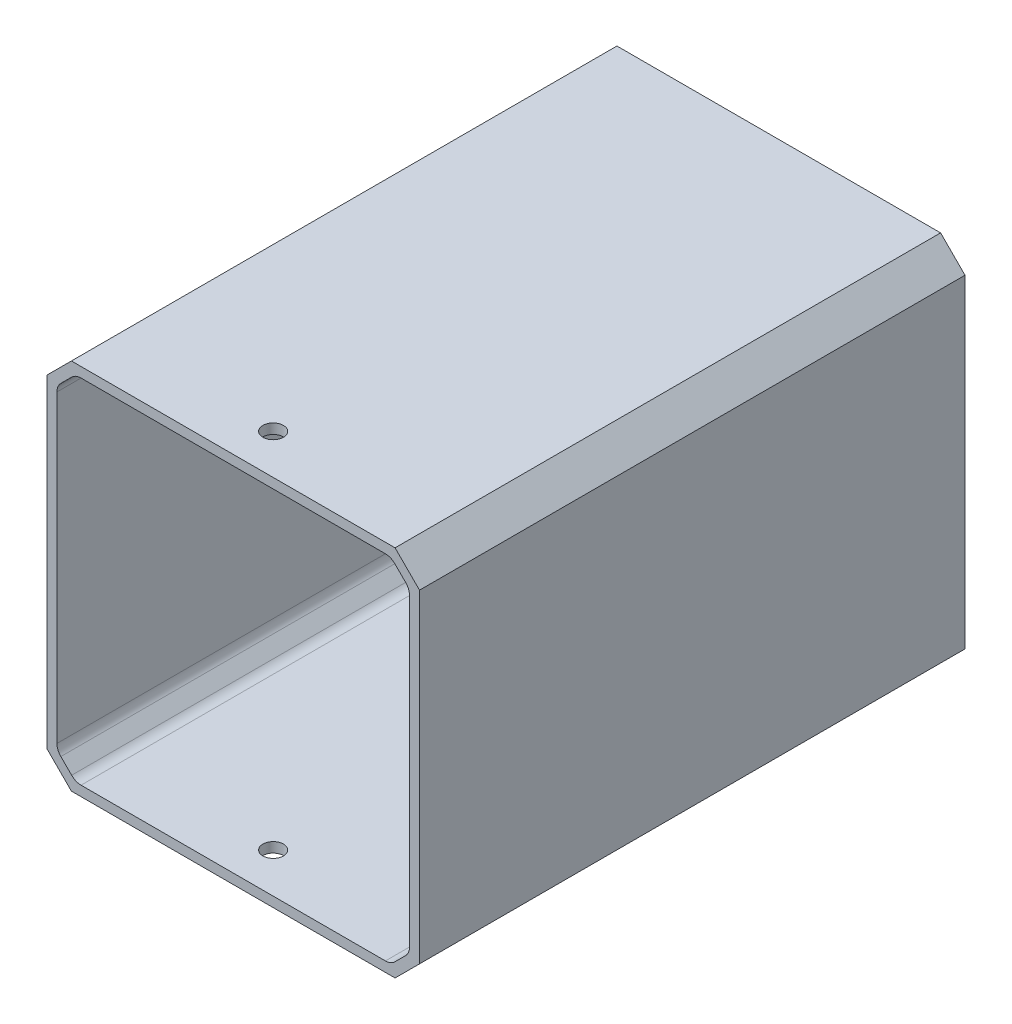
ISO-10303-21;
HEADER;
FILE_DESCRIPTION(('STEP AP214'),'2;1');
FILE_NAME('part.step','',(''),(''),'','','');
FILE_SCHEMA(('AUTOMOTIVE_DESIGN { 1 0 10303 214 1 1 1 1 }'));
ENDSEC;
DATA;
#1=APPLICATION_CONTEXT('core data for automotive mechanical design processes');
#2=APPLICATION_PROTOCOL_DEFINITION('international standard','automotive_design',2000,#1);
#3=PRODUCT_CONTEXT('',#1,'mechanical');
#4=PRODUCT('Part','Part','',(#3));
#5=PRODUCT_RELATED_PRODUCT_CATEGORY('part','',(#4));
#6=PRODUCT_DEFINITION_FORMATION('','',#4);
#7=PRODUCT_DEFINITION_CONTEXT('part definition',#1,'design');
#8=PRODUCT_DEFINITION('design','',#6,#7);
#9=PRODUCT_DEFINITION_SHAPE('','',#8);
#10=(LENGTH_UNIT() NAMED_UNIT(*) SI_UNIT(.MILLI.,.METRE.));
#11=(NAMED_UNIT(*) PLANE_ANGLE_UNIT() SI_UNIT($,.RADIAN.));
#12=(NAMED_UNIT(*) SI_UNIT($,.STERADIAN.) SOLID_ANGLE_UNIT());
#13=UNCERTAINTY_MEASURE_WITH_UNIT(LENGTH_MEASURE(1.E-05),#10,'distance_accuracy_value','');
#14=(GEOMETRIC_REPRESENTATION_CONTEXT(3) GLOBAL_UNCERTAINTY_ASSIGNED_CONTEXT((#13)) GLOBAL_UNIT_ASSIGNED_CONTEXT((#10,
#11,#12)) REPRESENTATION_CONTEXT('',''));
#15=CARTESIAN_POINT('',(0.,0.,0.));
#16=DIRECTION('',(0.,0.,1.));
#17=DIRECTION('',(1.,0.,0.));
#18=AXIS2_PLACEMENT_3D('',#15,#16,#17);
#19=CARTESIAN_POINT('',(28.,24.3259018078045,2.));
#20=DIRECTION('',(-1.,0.,0.));
#21=DIRECTION('',(0.,-1.,0.));
#22=AXIS2_PLACEMENT_3D('',#19,#20,#21);
#23=PLANE('',#22);
#24=DIRECTION('',(0.,1.,0.));
#25=VECTOR('',#24,1.);
#26=CARTESIAN_POINT('',(28.,24.3259018078045,0.));
#27=LINE('',#26,#25);
#28=CARTESIAN_POINT('',(28.,-24.3259018078045,0.));
#29=VERTEX_POINT('',#28);
#30=CARTESIAN_POINT('',(28.,24.3259018078045,0.));
#31=VERTEX_POINT('',#30);
#32=EDGE_CURVE('E353',#29,#31,#27,.T.);
#33=ORIENTED_EDGE('',*,*,#32,.T.);
#34=DIRECTION('',(0.,0.,-1.));
#35=VECTOR('',#34,1.);
#36=CARTESIAN_POINT('',(28.,24.3259018078045,2.));
#37=LINE('',#36,#35);
#38=CARTESIAN_POINT('',(28.,24.3259018078045,82.));
#39=VERTEX_POINT('',#38);
#40=EDGE_CURVE('E355',#39,#31,#37,.T.);
#41=ORIENTED_EDGE('',*,*,#40,.F.);
#42=DIRECTION('',(0.,1.,0.));
#43=VECTOR('',#42,1.);
#44=CARTESIAN_POINT('',(28.,-24.3259018078045,82.));
#45=LINE('',#44,#43);
#46=CARTESIAN_POINT('',(28.,-24.3259018078045,82.));
#47=VERTEX_POINT('',#46);
#48=EDGE_CURVE('E319',#47,#39,#45,.T.);
#49=ORIENTED_EDGE('',*,*,#48,.F.);
#50=DIRECTION('',(0.,0.,-1.));
#51=VECTOR('',#50,1.);
#52=CARTESIAN_POINT('',(28.,-24.3259018078045,2.));
#53=LINE('',#52,#51);
#54=EDGE_CURVE('E358',#47,#29,#53,.T.);
#55=ORIENTED_EDGE('',*,*,#54,.T.);
#56=EDGE_LOOP('',(#33,#41,#49,#55));
#57=FACE_BOUND('',#56,.T.);
#58=ADVANCED_FACE('F33',(#57),#23,.F.);
#59=CARTESIAN_POINT('',(0.,0.,2.));
#60=DIRECTION('',(0.,0.,1.));
#61=DIRECTION('',(1.,0.,0.));
#62=AXIS2_PLACEMENT_3D('',#59,#60,#61);
#63=PLANE('',#62);
#64=CARTESIAN_POINT('',(0.,0.,2.));
#65=DIRECTION('',(0.,0.,1.));
#66=DIRECTION('',(1.,0.,0.));
#67=AXIS2_PLACEMENT_3D('',#64,#65,#66);
#68=CIRCLE('',#67,11.15);
#69=CARTESIAN_POINT('',(-11.1004504413109,-1.05,2.));
#70=VERTEX_POINT('',#69);
#71=CARTESIAN_POINT('',(-11.1004504413109,1.05,2.));
#72=VERTEX_POINT('',#71);
#73=EDGE_CURVE('E226',#70,#72,#68,.T.);
#74=ORIENTED_EDGE('',*,*,#73,.F.);
#75=DIRECTION('',(1.,0.,0.));
#76=VECTOR('',#75,1.);
#77=CARTESIAN_POINT('',(-10.8280884739644,-1.05,2.));
#78=LINE('',#77,#76);
#79=CARTESIAN_POINT('',(-9.6,-1.05,2.));
#80=VERTEX_POINT('',#79);
#81=EDGE_CURVE('E218',#70,#80,#78,.T.);
#82=ORIENTED_EDGE('',*,*,#81,.T.);
#83=DIRECTION('',(0.,1.,0.));
#84=VECTOR('',#83,1.);
#85=CARTESIAN_POINT('',(-9.6,-1.05,2.));
#86=LINE('',#85,#84);
#87=CARTESIAN_POINT('',(-9.6,1.05,2.));
#88=VERTEX_POINT('',#87);
#89=EDGE_CURVE('E224',#80,#88,#86,.T.);
#90=ORIENTED_EDGE('',*,*,#89,.T.);
#91=DIRECTION('',(-1.,0.,0.));
#92=VECTOR('',#91,1.);
#93=CARTESIAN_POINT('',(-10.8280884739644,1.05,2.));
#94=LINE('',#93,#92);
#95=EDGE_CURVE('E231',#88,#72,#94,.T.);
#96=ORIENTED_EDGE('',*,*,#95,.T.);
#97=EDGE_LOOP('',(#74,#82,#90,#96));
#98=FACE_BOUND('',#97,.T.);
#99=DIRECTION('',(1.,0.,0.));
#100=VECTOR('',#99,1.);
#101=CARTESIAN_POINT('',(-23.7045814642449,-26.5,2.));
#102=LINE('',#101,#100);
#103=CARTESIAN_POINT('',(-22.8761543394987,-26.5,2.));
#104=VERTEX_POINT('',#103);
#105=CARTESIAN_POINT('',(22.8761543394987,-26.5,2.));
#106=VERTEX_POINT('',#105);
#107=EDGE_CURVE('E291',#104,#106,#102,.T.);
#108=ORIENTED_EDGE('',*,*,#107,.T.);
#109=CARTESIAN_POINT('',(22.8761543394987,-24.5,2.));
#110=DIRECTION('',(0.,0.,1.));
#111=DIRECTION('',(1.,0.,0.));
#112=AXIS2_PLACEMENT_3D('',#109,#110,#111);
#113=CIRCLE('',#112,2.);
#114=CARTESIAN_POINT('',(24.2903679018718,-25.9142135623731,2.));
#115=VERTEX_POINT('',#114);
#116=EDGE_CURVE('E404',#106,#115,#113,.T.);
#117=ORIENTED_EDGE('',*,*,#116,.T.);
#118=DIRECTION('',(0.707106781186548,0.707106781186548,0.));
#119=VECTOR('',#118,1.);
#120=CARTESIAN_POINT('',(23.7045814642449,-26.5,2.));
#121=LINE('',#120,#119);
#122=CARTESIAN_POINT('',(25.9142135623731,-24.2903679018718,2.));
#123=VERTEX_POINT('',#122);
#124=EDGE_CURVE('E294',#115,#123,#121,.T.);
#125=ORIENTED_EDGE('',*,*,#124,.T.);
#126=CARTESIAN_POINT('',(24.5,-22.8761543394987,2.));
#127=DIRECTION('',(0.,0.,1.));
#128=DIRECTION('',(1.,0.,0.));
#129=AXIS2_PLACEMENT_3D('',#126,#127,#128);
#130=CIRCLE('',#129,2.);
#131=CARTESIAN_POINT('',(26.5,-22.8761543394987,2.));
#132=VERTEX_POINT('',#131);
#133=EDGE_CURVE('E402',#123,#132,#130,.T.);
#134=ORIENTED_EDGE('',*,*,#133,.T.);
#135=DIRECTION('',(0.,1.,0.));
#136=VECTOR('',#135,1.);
#137=CARTESIAN_POINT('',(26.5,-23.7045814642449,2.));
#138=LINE('',#137,#136);
#139=CARTESIAN_POINT('',(26.5,22.8761543394987,2.));
#140=VERTEX_POINT('',#139);
#141=EDGE_CURVE('E297',#132,#140,#138,.T.);
#142=ORIENTED_EDGE('',*,*,#141,.T.);
#143=CARTESIAN_POINT('',(24.5,22.8761543394987,2.));
#144=DIRECTION('',(0.,0.,1.));
#145=DIRECTION('',(1.,0.,0.));
#146=AXIS2_PLACEMENT_3D('',#143,#144,#145);
#147=CIRCLE('',#146,2.);
#148=CARTESIAN_POINT('',(25.9142135623731,24.2903679018718,2.));
#149=VERTEX_POINT('',#148);
#150=EDGE_CURVE('E396',#140,#149,#147,.T.);
#151=ORIENTED_EDGE('',*,*,#150,.T.);
#152=DIRECTION('',(-0.707106781186547,0.707106781186548,0.));
#153=VECTOR('',#152,1.);
#154=CARTESIAN_POINT('',(26.5,23.7045814642449,2.));
#155=LINE('',#154,#153);
#156=CARTESIAN_POINT('',(24.2903679018718,25.9142135623731,2.));
#157=VERTEX_POINT('',#156);
#158=EDGE_CURVE('E300',#149,#157,#155,.T.);
#159=ORIENTED_EDGE('',*,*,#158,.T.);
#160=CARTESIAN_POINT('',(22.8761543394987,24.5,2.));
#161=DIRECTION('',(0.,0.,1.));
#162=DIRECTION('',(1.,0.,0.));
#163=AXIS2_PLACEMENT_3D('',#160,#161,#162);
#164=CIRCLE('',#163,2.);
#165=CARTESIAN_POINT('',(22.8761543394987,26.5,2.));
#166=VERTEX_POINT('',#165);
#167=EDGE_CURVE('E394',#157,#166,#164,.T.);
#168=ORIENTED_EDGE('',*,*,#167,.T.);
#169=DIRECTION('',(-1.,0.,0.));
#170=VECTOR('',#169,1.);
#171=CARTESIAN_POINT('',(23.7045814642449,26.5,2.));
#172=LINE('',#171,#170);
#173=CARTESIAN_POINT('',(-22.8761543394987,26.5,2.));
#174=VERTEX_POINT('',#173);
#175=EDGE_CURVE('E303',#166,#174,#172,.T.);
#176=ORIENTED_EDGE('',*,*,#175,.T.);
#177=CARTESIAN_POINT('',(-22.8761543394987,24.5,2.));
#178=DIRECTION('',(0.,0.,1.));
#179=DIRECTION('',(1.,0.,0.));
#180=AXIS2_PLACEMENT_3D('',#177,#178,#179);
#181=CIRCLE('',#180,2.);
#182=CARTESIAN_POINT('',(-24.2903679018718,25.9142135623731,2.));
#183=VERTEX_POINT('',#182);
#184=EDGE_CURVE('E392',#174,#183,#181,.T.);
#185=ORIENTED_EDGE('',*,*,#184,.T.);
#186=DIRECTION('',(-0.707106781186548,-0.707106781186547,0.));
#187=VECTOR('',#186,1.);
#188=CARTESIAN_POINT('',(-23.7045814642449,26.5,2.));
#189=LINE('',#188,#187);
#190=CARTESIAN_POINT('',(-25.9142135623731,24.2903679018718,2.));
#191=VERTEX_POINT('',#190);
#192=EDGE_CURVE('E306',#183,#191,#189,.T.);
#193=ORIENTED_EDGE('',*,*,#192,.T.);
#194=CARTESIAN_POINT('',(-24.5,22.8761543394987,2.));
#195=DIRECTION('',(0.,0.,1.));
#196=DIRECTION('',(1.,0.,0.));
#197=AXIS2_PLACEMENT_3D('',#194,#195,#196);
#198=CIRCLE('',#197,2.);
#199=CARTESIAN_POINT('',(-26.5,22.8761543394987,2.));
#200=VERTEX_POINT('',#199);
#201=EDGE_CURVE('E390',#191,#200,#198,.T.);
#202=ORIENTED_EDGE('',*,*,#201,.T.);
#203=DIRECTION('',(0.,-1.,0.));
#204=VECTOR('',#203,1.);
#205=CARTESIAN_POINT('',(-26.5,23.7045814642449,2.));
#206=LINE('',#205,#204);
#207=CARTESIAN_POINT('',(-26.5,-22.8761543394987,2.));
#208=VERTEX_POINT('',#207);
#209=EDGE_CURVE('E268',#200,#208,#206,.T.);
#210=ORIENTED_EDGE('',*,*,#209,.T.);
#211=CARTESIAN_POINT('',(-24.5,-22.8761543394987,2.));
#212=DIRECTION('',(0.,0.,1.));
#213=DIRECTION('',(1.,0.,0.));
#214=AXIS2_PLACEMENT_3D('',#211,#212,#213);
#215=CIRCLE('',#214,2.);
#216=CARTESIAN_POINT('',(-25.9142135623731,-24.2903679018718,2.));
#217=VERTEX_POINT('',#216);
#218=EDGE_CURVE('E398',#208,#217,#215,.T.);
#219=ORIENTED_EDGE('',*,*,#218,.T.);
#220=DIRECTION('',(0.707106781186548,-0.707106781186547,0.));
#221=VECTOR('',#220,1.);
#222=CARTESIAN_POINT('',(-26.5,-23.7045814642449,2.));
#223=LINE('',#222,#221);
#224=CARTESIAN_POINT('',(-24.2903679018718,-25.9142135623731,2.));
#225=VERTEX_POINT('',#224);
#226=EDGE_CURVE('E263',#217,#225,#223,.T.);
#227=ORIENTED_EDGE('',*,*,#226,.T.);
#228=CARTESIAN_POINT('',(-22.8761543394987,-24.5,2.));
#229=DIRECTION('',(0.,0.,1.));
#230=DIRECTION('',(1.,0.,0.));
#231=AXIS2_PLACEMENT_3D('',#228,#229,#230);
#232=CIRCLE('',#231,2.);
#233=EDGE_CURVE('E400',#225,#104,#232,.T.);
#234=ORIENTED_EDGE('',*,*,#233,.T.);
#235=EDGE_LOOP('',(#108,#117,#125,#134,#142,#151,#159,#168,#176,#185,#193,#202,#210,#219,#227,#234));
#236=FACE_BOUND('',#235,.T.);
#237=ADVANCED_FACE('F220',(#98,#236),#63,.T.);
#238=CARTESIAN_POINT('',(0.,0.,0.));
#239=DIRECTION('',(0.,0.,1.));
#240=DIRECTION('',(1.,0.,0.));
#241=AXIS2_PLACEMENT_3D('',#238,#239,#240);
#242=PLANE('',#241);
#243=DIRECTION('',(-1.,0.,0.));
#244=VECTOR('',#243,1.);
#245=CARTESIAN_POINT('',(-10.8280884739644,-1.05,0.));
#246=LINE('',#245,#244);
#247=CARTESIAN_POINT('',(-9.6,-1.05,0.));
#248=VERTEX_POINT('',#247);
#249=CARTESIAN_POINT('',(-11.1004504413109,-1.05,0.));
#250=VERTEX_POINT('',#249);
#251=EDGE_CURVE('E236',#248,#250,#246,.T.);
#252=ORIENTED_EDGE('',*,*,#251,.T.);
#253=CARTESIAN_POINT('',(0.,0.,0.));
#254=DIRECTION('',(0.,0.,1.));
#255=DIRECTION('',(1.,0.,0.));
#256=AXIS2_PLACEMENT_3D('',#253,#254,#255);
#257=CIRCLE('',#256,11.15);
#258=CARTESIAN_POINT('',(-11.1004504413109,1.05,0.));
#259=VERTEX_POINT('',#258);
#260=EDGE_CURVE('E334',#250,#259,#257,.T.);
#261=ORIENTED_EDGE('',*,*,#260,.T.);
#262=DIRECTION('',(1.,0.,0.));
#263=VECTOR('',#262,1.);
#264=CARTESIAN_POINT('',(-10.8280884739644,1.05,0.));
#265=LINE('',#264,#263);
#266=CARTESIAN_POINT('',(-9.6,1.05,0.));
#267=VERTEX_POINT('',#266);
#268=EDGE_CURVE('E249',#259,#267,#265,.T.);
#269=ORIENTED_EDGE('',*,*,#268,.T.);
#270=DIRECTION('',(0.,-1.,0.));
#271=VECTOR('',#270,1.);
#272=CARTESIAN_POINT('',(-9.6,-1.05,0.));
#273=LINE('',#272,#271);
#274=EDGE_CURVE('E251',#267,#248,#273,.T.);
#275=ORIENTED_EDGE('',*,*,#274,.T.);
#276=EDGE_LOOP('',(#252,#261,#269,#275));
#277=FACE_BOUND('',#276,.T.);
#278=DIRECTION('',(-0.707106781186547,0.707106781186548,0.));
#279=VECTOR('',#278,1.);
#280=CARTESIAN_POINT('',(28.,24.3259018078045,0.));
#281=LINE('',#280,#279);
#282=CARTESIAN_POINT('',(24.3259018078045,28.,0.));
#283=VERTEX_POINT('',#282);
#284=EDGE_CURVE('E336',#31,#283,#281,.T.);
#285=ORIENTED_EDGE('',*,*,#284,.F.);
#286=ORIENTED_EDGE('',*,*,#32,.F.);
#287=DIRECTION('',(0.707106781186548,0.707106781186548,0.));
#288=VECTOR('',#287,1.);
#289=CARTESIAN_POINT('',(24.3259018078045,-28.,0.));
#290=LINE('',#289,#288);
#291=CARTESIAN_POINT('',(24.3259018078045,-28.,0.));
#292=VERTEX_POINT('',#291);
#293=EDGE_CURVE('E351',#292,#29,#290,.T.);
#294=ORIENTED_EDGE('',*,*,#293,.F.);
#295=DIRECTION('',(1.,0.,0.));
#296=VECTOR('',#295,1.);
#297=CARTESIAN_POINT('',(-24.3259018078045,-28.,0.));
#298=LINE('',#297,#296);
#299=CARTESIAN_POINT('',(-24.3259018078045,-28.,0.));
#300=VERTEX_POINT('',#299);
#301=EDGE_CURVE('E349',#300,#292,#298,.T.);
#302=ORIENTED_EDGE('',*,*,#301,.F.);
#303=DIRECTION('',(0.707106781186548,-0.707106781186547,0.));
#304=VECTOR('',#303,1.);
#305=CARTESIAN_POINT('',(-28.,-24.3259018078045,0.));
#306=LINE('',#305,#304);
#307=CARTESIAN_POINT('',(-28.,-24.3259018078045,0.));
#308=VERTEX_POINT('',#307);
#309=EDGE_CURVE('E347',#308,#300,#306,.T.);
#310=ORIENTED_EDGE('',*,*,#309,.F.);
#311=DIRECTION('',(0.,-1.,0.));
#312=VECTOR('',#311,1.);
#313=CARTESIAN_POINT('',(-28.,24.3259018078045,0.));
#314=LINE('',#313,#312);
#315=CARTESIAN_POINT('',(-28.,24.3259018078045,0.));
#316=VERTEX_POINT('',#315);
#317=EDGE_CURVE('E345',#316,#308,#314,.T.);
#318=ORIENTED_EDGE('',*,*,#317,.F.);
#319=DIRECTION('',(-0.707106781186548,-0.707106781186547,0.));
#320=VECTOR('',#319,1.);
#321=CARTESIAN_POINT('',(-24.3259018078045,28.,0.));
#322=LINE('',#321,#320);
#323=CARTESIAN_POINT('',(-24.3259018078045,28.,0.));
#324=VERTEX_POINT('',#323);
#325=EDGE_CURVE('E343',#324,#316,#322,.T.);
#326=ORIENTED_EDGE('',*,*,#325,.F.);
#327=DIRECTION('',(-1.,0.,0.));
#328=VECTOR('',#327,1.);
#329=CARTESIAN_POINT('',(-24.3259018078045,28.,0.));
#330=LINE('',#329,#328);
#331=EDGE_CURVE('E341',#283,#324,#330,.T.);
#332=ORIENTED_EDGE('',*,*,#331,.F.);
#333=EDGE_LOOP('',(#285,#286,#294,#302,#310,#318,#326,#332));
#334=FACE_BOUND('',#333,.T.);
#335=ADVANCED_FACE('F530',(#277,#334),#242,.F.);
#336=CARTESIAN_POINT('',(28.,24.3259018078045,2.));
#337=DIRECTION('',(-0.707106781186548,-0.707106781186547,0.));
#338=DIRECTION('',(0.707106781186547,-0.707106781186548,0.));
#339=AXIS2_PLACEMENT_3D('',#336,#337,#338);
#340=PLANE('',#339);
#341=ORIENTED_EDGE('',*,*,#284,.T.);
#342=DIRECTION('',(0.,0.,-1.));
#343=VECTOR('',#342,1.);
#344=CARTESIAN_POINT('',(24.3259018078045,28.,2.));
#345=LINE('',#344,#343);
#346=CARTESIAN_POINT('',(24.3259018078045,28.,82.));
#347=VERTEX_POINT('',#346);
#348=EDGE_CURVE('E376',#347,#283,#345,.T.);
#349=ORIENTED_EDGE('',*,*,#348,.F.);
#350=DIRECTION('',(-0.707106781186547,0.707106781186548,0.));
#351=VECTOR('',#350,1.);
#352=CARTESIAN_POINT('',(28.,24.3259018078045,82.));
#353=LINE('',#352,#351);
#354=EDGE_CURVE('E322',#39,#347,#353,.T.);
#355=ORIENTED_EDGE('',*,*,#354,.F.);
#356=ORIENTED_EDGE('',*,*,#40,.T.);
#357=EDGE_LOOP('',(#341,#349,#355,#356));
#358=FACE_BOUND('',#357,.T.);
#359=ADVANCED_FACE('F558',(#358),#340,.F.);
#360=CARTESIAN_POINT('',(-24.3259018078045,28.,2.));
#361=DIRECTION('',(0.,-1.,0.));
#362=DIRECTION('',(1.,0.,0.));
#363=AXIS2_PLACEMENT_3D('',#360,#361,#362);
#364=PLANE('',#363);
#365=CARTESIAN_POINT('',(0.,28.,76.));
#366=DIRECTION('',(0.,-1.,0.));
#367=DIRECTION('',(1.,0.,0.));
#368=AXIS2_PLACEMENT_3D('',#365,#366,#367);
#369=CIRCLE('',#368,1.54999999999999);
#370=CARTESIAN_POINT('',(1.54999999999999,28.,76.));
#371=VERTEX_POINT('',#370);
#372=EDGE_CURVE('E260',#371,#371,#369,.T.);
#373=ORIENTED_EDGE('',*,*,#372,.T.);
#374=EDGE_LOOP('',(#373));
#375=FACE_BOUND('',#374,.T.);
#376=ORIENTED_EDGE('',*,*,#331,.T.);
#377=DIRECTION('',(0.,0.,-1.));
#378=VECTOR('',#377,1.);
#379=CARTESIAN_POINT('',(-24.3259018078045,28.,2.));
#380=LINE('',#379,#378);
#381=CARTESIAN_POINT('',(-24.3259018078045,28.,82.));
#382=VERTEX_POINT('',#381);
#383=EDGE_CURVE('E373',#382,#324,#380,.T.);
#384=ORIENTED_EDGE('',*,*,#383,.F.);
#385=DIRECTION('',(-1.,0.,0.));
#386=VECTOR('',#385,1.);
#387=CARTESIAN_POINT('',(24.3259018078045,28.,82.));
#388=LINE('',#387,#386);
#389=EDGE_CURVE('E325',#347,#382,#388,.T.);
#390=ORIENTED_EDGE('',*,*,#389,.F.);
#391=ORIENTED_EDGE('',*,*,#348,.T.);
#392=EDGE_LOOP('',(#376,#384,#390,#391));
#393=FACE_BOUND('',#392,.T.);
#394=ADVANCED_FACE('F554',(#375,#393),#364,.F.);
#395=CARTESIAN_POINT('',(-24.3259018078045,28.,2.));
#396=DIRECTION('',(0.707106781186547,-0.707106781186548,0.));
#397=DIRECTION('',(0.707106781186548,0.707106781186547,0.));
#398=AXIS2_PLACEMENT_3D('',#395,#396,#397);
#399=PLANE('',#398);
#400=ORIENTED_EDGE('',*,*,#325,.T.);
#401=DIRECTION('',(0.,0.,-1.));
#402=VECTOR('',#401,1.);
#403=CARTESIAN_POINT('',(-28.,24.3259018078045,2.));
#404=LINE('',#403,#402);
#405=CARTESIAN_POINT('',(-28.,24.3259018078045,82.));
#406=VERTEX_POINT('',#405);
#407=EDGE_CURVE('E370',#406,#316,#404,.T.);
#408=ORIENTED_EDGE('',*,*,#407,.F.);
#409=DIRECTION('',(-0.707106781186548,-0.707106781186547,0.));
#410=VECTOR('',#409,1.);
#411=CARTESIAN_POINT('',(-24.3259018078045,28.,82.));
#412=LINE('',#411,#410);
#413=EDGE_CURVE('E328',#382,#406,#412,.T.);
#414=ORIENTED_EDGE('',*,*,#413,.F.);
#415=ORIENTED_EDGE('',*,*,#383,.T.);
#416=EDGE_LOOP('',(#400,#408,#414,#415));
#417=FACE_BOUND('',#416,.T.);
#418=ADVANCED_FACE('F550',(#417),#399,.F.);
#419=CARTESIAN_POINT('',(-28.,24.3259018078045,2.));
#420=DIRECTION('',(1.,0.,0.));
#421=DIRECTION('',(0.,1.,0.));
#422=AXIS2_PLACEMENT_3D('',#419,#420,#421);
#423=PLANE('',#422);
#424=ORIENTED_EDGE('',*,*,#317,.T.);
#425=DIRECTION('',(0.,0.,-1.));
#426=VECTOR('',#425,1.);
#427=CARTESIAN_POINT('',(-28.,-24.3259018078045,2.));
#428=LINE('',#427,#426);
#429=CARTESIAN_POINT('',(-28.,-24.3259018078045,82.));
#430=VERTEX_POINT('',#429);
#431=EDGE_CURVE('E367',#430,#308,#428,.T.);
#432=ORIENTED_EDGE('',*,*,#431,.F.);
#433=DIRECTION('',(0.,-1.,0.));
#434=VECTOR('',#433,1.);
#435=CARTESIAN_POINT('',(-28.,24.3259018078045,82.));
#436=LINE('',#435,#434);
#437=EDGE_CURVE('E331',#406,#430,#436,.T.);
#438=ORIENTED_EDGE('',*,*,#437,.F.);
#439=ORIENTED_EDGE('',*,*,#407,.T.);
#440=EDGE_LOOP('',(#424,#432,#438,#439));
#441=FACE_BOUND('',#440,.T.);
#442=ADVANCED_FACE('F546',(#441),#423,.F.);
#443=CARTESIAN_POINT('',(-28.,-24.3259018078045,2.));
#444=DIRECTION('',(0.707106781186547,0.707106781186548,0.));
#445=DIRECTION('',(-0.707106781186548,0.707106781186547,0.));
#446=AXIS2_PLACEMENT_3D('',#443,#444,#445);
#447=PLANE('',#446);
#448=ORIENTED_EDGE('',*,*,#309,.T.);
#449=DIRECTION('',(0.,0.,-1.));
#450=VECTOR('',#449,1.);
#451=CARTESIAN_POINT('',(-24.3259018078045,-28.,2.));
#452=LINE('',#451,#450);
#453=CARTESIAN_POINT('',(-24.3259018078045,-28.,82.));
#454=VERTEX_POINT('',#453);
#455=EDGE_CURVE('E364',#454,#300,#452,.T.);
#456=ORIENTED_EDGE('',*,*,#455,.F.);
#457=DIRECTION('',(0.707106781186548,-0.707106781186547,0.));
#458=VECTOR('',#457,1.);
#459=CARTESIAN_POINT('',(-28.,-24.3259018078045,82.));
#460=LINE('',#459,#458);
#461=EDGE_CURVE('E288',#430,#454,#460,.T.);
#462=ORIENTED_EDGE('',*,*,#461,.F.);
#463=ORIENTED_EDGE('',*,*,#431,.T.);
#464=EDGE_LOOP('',(#448,#456,#462,#463));
#465=FACE_BOUND('',#464,.T.);
#466=ADVANCED_FACE('F542',(#465),#447,.F.);
#467=CARTESIAN_POINT('',(-24.3259018078045,-28.,2.));
#468=DIRECTION('',(0.,1.,0.));
#469=DIRECTION('',(0.,0.,1.));
#470=AXIS2_PLACEMENT_3D('',#467,#468,#469);
#471=PLANE('',#470);
#472=CARTESIAN_POINT('',(0.,-28.,76.));
#473=DIRECTION('',(0.,1.,0.));
#474=DIRECTION('',(0.,0.,1.));
#475=AXIS2_PLACEMENT_3D('',#472,#473,#474);
#476=CIRCLE('',#475,1.54999999999999);
#477=CARTESIAN_POINT('',(0.,-28.,77.55));
#478=VERTEX_POINT('',#477);
#479=EDGE_CURVE('E253',#478,#478,#476,.T.);
#480=ORIENTED_EDGE('',*,*,#479,.T.);
#481=EDGE_LOOP('',(#480));
#482=FACE_BOUND('',#481,.T.);
#483=ORIENTED_EDGE('',*,*,#301,.T.);
#484=DIRECTION('',(0.,0.,-1.));
#485=VECTOR('',#484,1.);
#486=CARTESIAN_POINT('',(24.3259018078045,-28.,2.));
#487=LINE('',#486,#485);
#488=CARTESIAN_POINT('',(24.3259018078045,-28.,82.));
#489=VERTEX_POINT('',#488);
#490=EDGE_CURVE('E361',#489,#292,#487,.T.);
#491=ORIENTED_EDGE('',*,*,#490,.F.);
#492=DIRECTION('',(1.,0.,0.));
#493=VECTOR('',#492,1.);
#494=CARTESIAN_POINT('',(-24.3259018078045,-28.,82.));
#495=LINE('',#494,#493);
#496=EDGE_CURVE('E313',#454,#489,#495,.T.);
#497=ORIENTED_EDGE('',*,*,#496,.F.);
#498=ORIENTED_EDGE('',*,*,#455,.T.);
#499=EDGE_LOOP('',(#483,#491,#497,#498));
#500=FACE_BOUND('',#499,.T.);
#501=ADVANCED_FACE('F538',(#482,#500),#471,.F.);
#502=CARTESIAN_POINT('',(24.3259018078045,-28.,2.));
#503=DIRECTION('',(-0.707106781186547,0.707106781186547,0.));
#504=DIRECTION('',(-0.707106781186548,-0.707106781186548,0.));
#505=AXIS2_PLACEMENT_3D('',#502,#503,#504);
#506=PLANE('',#505);
#507=ORIENTED_EDGE('',*,*,#293,.T.);
#508=ORIENTED_EDGE('',*,*,#54,.F.);
#509=DIRECTION('',(0.707106781186548,0.707106781186548,0.));
#510=VECTOR('',#509,1.);
#511=CARTESIAN_POINT('',(24.3259018078045,-28.,82.));
#512=LINE('',#511,#510);
#513=EDGE_CURVE('E316',#489,#47,#512,.T.);
#514=ORIENTED_EDGE('',*,*,#513,.F.);
#515=ORIENTED_EDGE('',*,*,#490,.T.);
#516=EDGE_LOOP('',(#507,#508,#514,#515));
#517=FACE_BOUND('',#516,.T.);
#518=ADVANCED_FACE('F534',(#517),#506,.F.);
#519=CARTESIAN_POINT('',(0.,0.,2.));
#520=DIRECTION('',(0.,0.,-1.));
#521=DIRECTION('',(-1.,0.,0.));
#522=AXIS2_PLACEMENT_3D('',#519,#520,#521);
#523=CYLINDRICAL_SURFACE('',#522,11.15);
#524=DIRECTION('',(0.,0.,-1.));
#525=VECTOR('',#524,1.);
#526=CARTESIAN_POINT('',(-11.1004504413109,-1.05,2.));
#527=LINE('',#526,#525);
#528=EDGE_CURVE('E383',#70,#250,#527,.T.);
#529=ORIENTED_EDGE('',*,*,#528,.F.);
#530=ORIENTED_EDGE('',*,*,#73,.T.);
#531=DIRECTION('',(0.,0.,-1.));
#532=VECTOR('',#531,1.);
#533=CARTESIAN_POINT('',(-11.1004504413109,1.05,2.));
#534=LINE('',#533,#532);
#535=EDGE_CURVE('E379',#259,#72,#534,.F.);
#536=ORIENTED_EDGE('',*,*,#535,.F.);
#537=ORIENTED_EDGE('',*,*,#260,.F.);
#538=EDGE_LOOP('',(#529,#530,#536,#537));
#539=FACE_BOUND('',#538,.T.);
#540=ADVANCED_FACE('F537',(#539),#523,.F.);
#541=CARTESIAN_POINT('',(0.,0.,82.));
#542=DIRECTION('',(0.,0.,1.));
#543=DIRECTION('',(1.,0.,0.));
#544=AXIS2_PLACEMENT_3D('',#541,#542,#543);
#545=PLANE('',#544);
#546=ORIENTED_EDGE('',*,*,#461,.T.);
#547=ORIENTED_EDGE('',*,*,#496,.T.);
#548=ORIENTED_EDGE('',*,*,#513,.T.);
#549=ORIENTED_EDGE('',*,*,#48,.T.);
#550=ORIENTED_EDGE('',*,*,#354,.T.);
#551=ORIENTED_EDGE('',*,*,#389,.T.);
#552=ORIENTED_EDGE('',*,*,#413,.T.);
#553=ORIENTED_EDGE('',*,*,#437,.T.);
#554=EDGE_LOOP('',(#546,#547,#548,#549,#550,#551,#552,#553));
#555=FACE_BOUND('',#554,.T.);
#556=DIRECTION('',(1.,0.,0.));
#557=VECTOR('',#556,1.);
#558=CARTESIAN_POINT('',(-23.7045814642449,-26.5,82.));
#559=LINE('',#558,#557);
#560=CARTESIAN_POINT('',(-22.8761543394987,-26.5,82.));
#561=VERTEX_POINT('',#560);
#562=CARTESIAN_POINT('',(22.8761543394987,-26.5,82.));
#563=VERTEX_POINT('',#562);
#564=EDGE_CURVE('E267',#561,#563,#559,.T.);
#565=ORIENTED_EDGE('',*,*,#564,.F.);
#566=CARTESIAN_POINT('',(-22.8761543394987,-24.5,82.));
#567=DIRECTION('',(0.,0.,1.));
#568=DIRECTION('',(1.,0.,0.));
#569=AXIS2_PLACEMENT_3D('',#566,#567,#568);
#570=CIRCLE('',#569,2.);
#571=CARTESIAN_POINT('',(-24.2903679018718,-25.9142135623731,82.));
#572=VERTEX_POINT('',#571);
#573=EDGE_CURVE('E444',#561,#572,#570,.F.);
#574=ORIENTED_EDGE('',*,*,#573,.T.);
#575=DIRECTION('',(0.707106781186548,-0.707106781186547,0.));
#576=VECTOR('',#575,1.);
#577=CARTESIAN_POINT('',(-26.5,-23.7045814642449,82.));
#578=LINE('',#577,#576);
#579=CARTESIAN_POINT('',(-25.9142135623731,-24.2903679018718,82.));
#580=VERTEX_POINT('',#579);
#581=EDGE_CURVE('E264',#580,#572,#578,.T.);
#582=ORIENTED_EDGE('',*,*,#581,.F.);
#583=CARTESIAN_POINT('',(-24.5,-22.8761543394987,82.));
#584=DIRECTION('',(0.,0.,1.));
#585=DIRECTION('',(1.,0.,0.));
#586=AXIS2_PLACEMENT_3D('',#583,#584,#585);
#587=CIRCLE('',#586,2.);
#588=CARTESIAN_POINT('',(-26.5,-22.8761543394987,82.));
#589=VERTEX_POINT('',#588);
#590=EDGE_CURVE('E446',#580,#589,#587,.F.);
#591=ORIENTED_EDGE('',*,*,#590,.T.);
#592=DIRECTION('',(0.,-1.,0.));
#593=VECTOR('',#592,1.);
#594=CARTESIAN_POINT('',(-26.5,23.7045814642449,82.));
#595=LINE('',#594,#593);
#596=CARTESIAN_POINT('',(-26.5,22.8761543394987,82.));
#597=VERTEX_POINT('',#596);
#598=EDGE_CURVE('E285',#597,#589,#595,.T.);
#599=ORIENTED_EDGE('',*,*,#598,.F.);
#600=CARTESIAN_POINT('',(-24.5,22.8761543394987,82.));
#601=DIRECTION('',(0.,0.,1.));
#602=DIRECTION('',(1.,0.,0.));
#603=AXIS2_PLACEMENT_3D('',#600,#601,#602);
#604=CIRCLE('',#603,2.);
#605=CARTESIAN_POINT('',(-25.9142135623731,24.2903679018718,82.));
#606=VERTEX_POINT('',#605);
#607=EDGE_CURVE('E11',#597,#606,#604,.F.);
#608=ORIENTED_EDGE('',*,*,#607,.T.);
#609=DIRECTION('',(-0.707106781186548,-0.707106781186547,0.));
#610=VECTOR('',#609,1.);
#611=CARTESIAN_POINT('',(-23.7045814642449,26.5,82.));
#612=LINE('',#611,#610);
#613=CARTESIAN_POINT('',(-24.2903679018718,25.9142135623731,82.));
#614=VERTEX_POINT('',#613);
#615=EDGE_CURVE('E283',#614,#606,#612,.T.);
#616=ORIENTED_EDGE('',*,*,#615,.F.);
#617=CARTESIAN_POINT('',(-22.8761543394987,24.5,82.));
#618=DIRECTION('',(0.,0.,1.));
#619=DIRECTION('',(1.,0.,0.));
#620=AXIS2_PLACEMENT_3D('',#617,#618,#619);
#621=CIRCLE('',#620,2.);
#622=CARTESIAN_POINT('',(-22.8761543394987,26.5,82.));
#623=VERTEX_POINT('',#622);
#624=EDGE_CURVE('E41',#614,#623,#621,.F.);
#625=ORIENTED_EDGE('',*,*,#624,.T.);
#626=DIRECTION('',(-1.,0.,0.));
#627=VECTOR('',#626,1.);
#628=CARTESIAN_POINT('',(23.7045814642449,26.5,82.));
#629=LINE('',#628,#627);
#630=CARTESIAN_POINT('',(22.8761543394987,26.5,82.));
#631=VERTEX_POINT('',#630);
#632=EDGE_CURVE('E280',#631,#623,#629,.T.);
#633=ORIENTED_EDGE('',*,*,#632,.F.);
#634=CARTESIAN_POINT('',(22.8761543394987,24.5,82.));
#635=DIRECTION('',(0.,0.,1.));
#636=DIRECTION('',(1.,0.,0.));
#637=AXIS2_PLACEMENT_3D('',#634,#635,#636);
#638=CIRCLE('',#637,2.);
#639=CARTESIAN_POINT('',(24.2903679018718,25.9142135623731,82.));
#640=VERTEX_POINT('',#639);
#641=EDGE_CURVE('E450',#631,#640,#638,.F.);
#642=ORIENTED_EDGE('',*,*,#641,.T.);
#643=DIRECTION('',(-0.707106781186547,0.707106781186548,0.));
#644=VECTOR('',#643,1.);
#645=CARTESIAN_POINT('',(26.5,23.7045814642449,82.));
#646=LINE('',#645,#644);
#647=CARTESIAN_POINT('',(25.9142135623731,24.2903679018718,82.));
#648=VERTEX_POINT('',#647);
#649=EDGE_CURVE('E277',#648,#640,#646,.T.);
#650=ORIENTED_EDGE('',*,*,#649,.F.);
#651=CARTESIAN_POINT('',(24.5,22.8761543394987,82.));
#652=DIRECTION('',(0.,0.,1.));
#653=DIRECTION('',(1.,0.,0.));
#654=AXIS2_PLACEMENT_3D('',#651,#652,#653);
#655=CIRCLE('',#654,2.);
#656=CARTESIAN_POINT('',(26.5,22.8761543394987,82.));
#657=VERTEX_POINT('',#656);
#658=EDGE_CURVE('E448',#648,#657,#655,.F.);
#659=ORIENTED_EDGE('',*,*,#658,.T.);
#660=DIRECTION('',(0.,1.,0.));
#661=VECTOR('',#660,1.);
#662=CARTESIAN_POINT('',(26.5,-23.7045814642449,82.));
#663=LINE('',#662,#661);
#664=CARTESIAN_POINT('',(26.5,-22.8761543394987,82.));
#665=VERTEX_POINT('',#664);
#666=EDGE_CURVE('E274',#665,#657,#663,.T.);
#667=ORIENTED_EDGE('',*,*,#666,.F.);
#668=CARTESIAN_POINT('',(24.5,-22.8761543394987,82.));
#669=DIRECTION('',(0.,0.,1.));
#670=DIRECTION('',(1.,0.,0.));
#671=AXIS2_PLACEMENT_3D('',#668,#669,#670);
#672=CIRCLE('',#671,2.);
#673=CARTESIAN_POINT('',(25.9142135623731,-24.2903679018718,82.));
#674=VERTEX_POINT('',#673);
#675=EDGE_CURVE('E442',#665,#674,#672,.F.);
#676=ORIENTED_EDGE('',*,*,#675,.T.);
#677=DIRECTION('',(0.707106781186548,0.707106781186548,0.));
#678=VECTOR('',#677,1.);
#679=CARTESIAN_POINT('',(23.7045814642449,-26.5,82.));
#680=LINE('',#679,#678);
#681=CARTESIAN_POINT('',(24.2903679018718,-25.9142135623731,82.));
#682=VERTEX_POINT('',#681);
#683=EDGE_CURVE('E271',#682,#674,#680,.T.);
#684=ORIENTED_EDGE('',*,*,#683,.F.);
#685=CARTESIAN_POINT('',(22.8761543394987,-24.5,82.));
#686=DIRECTION('',(0.,0.,1.));
#687=DIRECTION('',(1.,0.,0.));
#688=AXIS2_PLACEMENT_3D('',#685,#686,#687);
#689=CIRCLE('',#688,2.);
#690=EDGE_CURVE('E440',#682,#563,#689,.F.);
#691=ORIENTED_EDGE('',*,*,#690,.T.);
#692=EDGE_LOOP('',(#565,#574,#582,#591,#599,#608,#616,#625,#633,#642,#650,#659,#667,#676,#684,#691));
#693=FACE_BOUND('',#692,.T.);
#694=ADVANCED_FACE('F454',(#555,#693),#545,.T.);
#695=CARTESIAN_POINT('',(-26.5,-23.7045814642449,82.));
#696=DIRECTION('',(0.707106781186547,0.707106781186548,0.));
#697=DIRECTION('',(-0.707106781186548,0.707106781186547,0.));
#698=AXIS2_PLACEMENT_3D('',#695,#696,#697);
#699=PLANE('',#698);
#700=ORIENTED_EDGE('',*,*,#581,.T.);
#701=DIRECTION('',(0.,0.,-1.));
#702=VECTOR('',#701,1.);
#703=CARTESIAN_POINT('',(-24.2903679018718,-25.9142135623731,2.));
#704=LINE('',#703,#702);
#705=EDGE_CURVE('E418',#572,#225,#704,.T.);
#706=ORIENTED_EDGE('',*,*,#705,.T.);
#707=ORIENTED_EDGE('',*,*,#226,.F.);
#708=DIRECTION('',(0.,0.,-1.));
#709=VECTOR('',#708,1.);
#710=CARTESIAN_POINT('',(-25.9142135623731,-24.2903679018718,82.));
#711=LINE('',#710,#709);
#712=EDGE_CURVE('E416',#217,#580,#711,.F.);
#713=ORIENTED_EDGE('',*,*,#712,.T.);
#714=EDGE_LOOP('',(#700,#706,#707,#713));
#715=FACE_BOUND('',#714,.T.);
#716=ADVANCED_FACE('F477',(#715),#699,.T.);
#717=CARTESIAN_POINT('',(-23.7045814642449,-26.5,82.));
#718=DIRECTION('',(0.,1.,0.));
#719=DIRECTION('',(0.,0.,1.));
#720=AXIS2_PLACEMENT_3D('',#717,#718,#719);
#721=PLANE('',#720);
#722=CARTESIAN_POINT('',(0.,-26.5,76.));
#723=DIRECTION('',(0.,1.,0.));
#724=DIRECTION('',(0.,0.,1.));
#725=AXIS2_PLACEMENT_3D('',#722,#723,#724);
#726=CIRCLE('',#725,1.54999999999999);
#727=CARTESIAN_POINT('',(0.,-26.5,77.55));
#728=VERTEX_POINT('',#727);
#729=EDGE_CURVE('E257',#728,#728,#726,.T.);
#730=ORIENTED_EDGE('',*,*,#729,.F.);
#731=EDGE_LOOP('',(#730));
#732=FACE_BOUND('',#731,.T.);
#733=ORIENTED_EDGE('',*,*,#564,.T.);
#734=DIRECTION('',(0.,0.,-1.));
#735=VECTOR('',#734,1.);
#736=CARTESIAN_POINT('',(22.8761543394987,-26.5,2.));
#737=LINE('',#736,#735);
#738=EDGE_CURVE('E387',#563,#106,#737,.T.);
#739=ORIENTED_EDGE('',*,*,#738,.T.);
#740=ORIENTED_EDGE('',*,*,#107,.F.);
#741=DIRECTION('',(0.,0.,-1.));
#742=VECTOR('',#741,1.);
#743=CARTESIAN_POINT('',(-22.8761543394987,-26.5,82.));
#744=LINE('',#743,#742);
#745=EDGE_CURVE('E385',#104,#561,#744,.F.);
#746=ORIENTED_EDGE('',*,*,#745,.T.);
#747=EDGE_LOOP('',(#733,#739,#740,#746));
#748=FACE_BOUND('',#747,.T.);
#749=ADVANCED_FACE('F486',(#732,#748),#721,.T.);
#750=CARTESIAN_POINT('',(23.7045814642449,-26.5,82.));
#751=DIRECTION('',(-0.707106781186548,0.707106781186548,0.));
#752=DIRECTION('',(-0.707106781186548,-0.707106781186548,0.));
#753=AXIS2_PLACEMENT_3D('',#750,#751,#752);
#754=PLANE('',#753);
#755=ORIENTED_EDGE('',*,*,#124,.F.);
#756=DIRECTION('',(0.,0.,-1.));
#757=VECTOR('',#756,1.);
#758=CARTESIAN_POINT('',(24.2903679018718,-25.9142135623731,82.));
#759=LINE('',#758,#757);
#760=EDGE_CURVE('E409',#115,#682,#759,.F.);
#761=ORIENTED_EDGE('',*,*,#760,.T.);
#762=ORIENTED_EDGE('',*,*,#683,.T.);
#763=DIRECTION('',(0.,0.,-1.));
#764=VECTOR('',#763,1.);
#765=CARTESIAN_POINT('',(25.9142135623731,-24.2903679018718,2.));
#766=LINE('',#765,#764);
#767=EDGE_CURVE('E406',#674,#123,#766,.T.);
#768=ORIENTED_EDGE('',*,*,#767,.T.);
#769=EDGE_LOOP('',(#755,#761,#762,#768));
#770=FACE_BOUND('',#769,.T.);
#771=ADVANCED_FACE('F494',(#770),#754,.T.);
#772=CARTESIAN_POINT('',(26.5,-23.7045814642449,82.));
#773=DIRECTION('',(-1.,0.,0.));
#774=DIRECTION('',(0.,-1.,0.));
#775=AXIS2_PLACEMENT_3D('',#772,#773,#774);
#776=PLANE('',#775);
#777=ORIENTED_EDGE('',*,*,#141,.F.);
#778=DIRECTION('',(0.,0.,-1.));
#779=VECTOR('',#778,1.);
#780=CARTESIAN_POINT('',(26.5,-22.8761543394987,82.));
#781=LINE('',#780,#779);
#782=EDGE_CURVE('E414',#132,#665,#781,.F.);
#783=ORIENTED_EDGE('',*,*,#782,.T.);
#784=ORIENTED_EDGE('',*,*,#666,.T.);
#785=DIRECTION('',(0.,0.,-1.));
#786=VECTOR('',#785,1.);
#787=CARTESIAN_POINT('',(26.5,22.8761543394987,2.));
#788=LINE('',#787,#786);
#789=EDGE_CURVE('E411',#657,#140,#788,.T.);
#790=ORIENTED_EDGE('',*,*,#789,.T.);
#791=EDGE_LOOP('',(#777,#783,#784,#790));
#792=FACE_BOUND('',#791,.T.);
#793=ADVANCED_FACE('F503',(#792),#776,.T.);
#794=CARTESIAN_POINT('',(26.5,23.7045814642449,82.));
#795=DIRECTION('',(-0.707106781186548,-0.707106781186547,0.));
#796=DIRECTION('',(0.707106781186547,-0.707106781186548,0.));
#797=AXIS2_PLACEMENT_3D('',#794,#795,#796);
#798=PLANE('',#797);
#799=ORIENTED_EDGE('',*,*,#158,.F.);
#800=DIRECTION('',(0.,0.,-1.));
#801=VECTOR('',#800,1.);
#802=CARTESIAN_POINT('',(25.9142135623731,24.2903679018718,82.));
#803=LINE('',#802,#801);
#804=EDGE_CURVE('E429',#149,#648,#803,.F.);
#805=ORIENTED_EDGE('',*,*,#804,.T.);
#806=ORIENTED_EDGE('',*,*,#649,.T.);
#807=DIRECTION('',(0.,0.,-1.));
#808=VECTOR('',#807,1.);
#809=CARTESIAN_POINT('',(24.2903679018718,25.9142135623731,2.));
#810=LINE('',#809,#808);
#811=EDGE_CURVE('E426',#640,#157,#810,.T.);
#812=ORIENTED_EDGE('',*,*,#811,.T.);
#813=EDGE_LOOP('',(#799,#805,#806,#812));
#814=FACE_BOUND('',#813,.T.);
#815=ADVANCED_FACE('F512',(#814),#798,.T.);
#816=CARTESIAN_POINT('',(23.7045814642449,26.5,82.));
#817=DIRECTION('',(0.,-1.,0.));
#818=DIRECTION('',(1.,0.,0.));
#819=AXIS2_PLACEMENT_3D('',#816,#817,#818);
#820=PLANE('',#819);
#821=CARTESIAN_POINT('',(0.,26.5,76.));
#822=DIRECTION('',(0.,-1.,0.));
#823=DIRECTION('',(1.,0.,0.));
#824=AXIS2_PLACEMENT_3D('',#821,#822,#823);
#825=CIRCLE('',#824,1.54999999999999);
#826=CARTESIAN_POINT('',(1.54999999999999,26.5,76.));
#827=VERTEX_POINT('',#826);
#828=EDGE_CURVE('E256',#827,#827,#825,.T.);
#829=ORIENTED_EDGE('',*,*,#828,.F.);
#830=EDGE_LOOP('',(#829));
#831=FACE_BOUND('',#830,.T.);
#832=ORIENTED_EDGE('',*,*,#175,.F.);
#833=DIRECTION('',(0.,0.,-1.));
#834=VECTOR('',#833,1.);
#835=CARTESIAN_POINT('',(22.8761543394987,26.5,82.));
#836=LINE('',#835,#834);
#837=EDGE_CURVE('E434',#166,#631,#836,.F.);
#838=ORIENTED_EDGE('',*,*,#837,.T.);
#839=ORIENTED_EDGE('',*,*,#632,.T.);
#840=DIRECTION('',(0.,0.,-1.));
#841=VECTOR('',#840,1.);
#842=CARTESIAN_POINT('',(-22.8761543394987,26.5,2.));
#843=LINE('',#842,#841);
#844=EDGE_CURVE('E431',#623,#174,#843,.T.);
#845=ORIENTED_EDGE('',*,*,#844,.T.);
#846=EDGE_LOOP('',(#832,#838,#839,#845));
#847=FACE_BOUND('',#846,.T.);
#848=ADVANCED_FACE('F460',(#831,#847),#820,.T.);
#849=CARTESIAN_POINT('',(-23.7045814642449,26.5,82.));
#850=DIRECTION('',(0.707106781186547,-0.707106781186548,0.));
#851=DIRECTION('',(0.707106781186548,0.707106781186547,0.));
#852=AXIS2_PLACEMENT_3D('',#849,#850,#851);
#853=PLANE('',#852);
#854=ORIENTED_EDGE('',*,*,#192,.F.);
#855=DIRECTION('',(0.,0.,-1.));
#856=VECTOR('',#855,1.);
#857=CARTESIAN_POINT('',(-24.2903679018718,25.9142135623731,82.));
#858=LINE('',#857,#856);
#859=EDGE_CURVE('E53',#183,#614,#858,.F.);
#860=ORIENTED_EDGE('',*,*,#859,.T.);
#861=ORIENTED_EDGE('',*,*,#615,.T.);
#862=DIRECTION('',(0.,0.,-1.));
#863=VECTOR('',#862,1.);
#864=CARTESIAN_POINT('',(-25.9142135623731,24.2903679018718,2.));
#865=LINE('',#864,#863);
#866=EDGE_CURVE('E436',#606,#191,#865,.T.);
#867=ORIENTED_EDGE('',*,*,#866,.T.);
#868=EDGE_LOOP('',(#854,#860,#861,#867));
#869=FACE_BOUND('',#868,.T.);
#870=ADVANCED_FACE('F463',(#869),#853,.T.);
#871=CARTESIAN_POINT('',(-26.5,23.7045814642449,82.));
#872=DIRECTION('',(1.,0.,0.));
#873=DIRECTION('',(0.,1.,0.));
#874=AXIS2_PLACEMENT_3D('',#871,#872,#873);
#875=PLANE('',#874);
#876=ORIENTED_EDGE('',*,*,#598,.T.);
#877=DIRECTION('',(0.,0.,-1.));
#878=VECTOR('',#877,1.);
#879=CARTESIAN_POINT('',(-26.5,-22.8761543394987,2.));
#880=LINE('',#879,#878);
#881=EDGE_CURVE('E423',#589,#208,#880,.T.);
#882=ORIENTED_EDGE('',*,*,#881,.T.);
#883=ORIENTED_EDGE('',*,*,#209,.F.);
#884=DIRECTION('',(0.,0.,-1.));
#885=VECTOR('',#884,1.);
#886=CARTESIAN_POINT('',(-26.5,22.8761543394987,82.));
#887=LINE('',#886,#885);
#888=EDGE_CURVE('E421',#200,#597,#887,.F.);
#889=ORIENTED_EDGE('',*,*,#888,.T.);
#890=EDGE_LOOP('',(#876,#882,#883,#889));
#891=FACE_BOUND('',#890,.T.);
#892=ADVANCED_FACE('F469',(#891),#875,.T.);
#893=CARTESIAN_POINT('',(0.,-28.,76.));
#894=DIRECTION('',(0.,1.,0.));
#895=DIRECTION('',(0.,0.,1.));
#896=AXIS2_PLACEMENT_3D('',#893,#894,#895);
#897=CYLINDRICAL_SURFACE('',#896,1.54999999999999);
#898=ORIENTED_EDGE('',*,*,#828,.T.);
#899=EDGE_LOOP('',(#898));
#900=FACE_BOUND('',#899,.T.);
#901=ORIENTED_EDGE('',*,*,#372,.F.);
#902=EDGE_LOOP('',(#901));
#903=FACE_BOUND('',#902,.T.);
#904=ADVANCED_FACE('F673',(#900,#903),#897,.F.);
#905=ORIENTED_EDGE('',*,*,#729,.T.);
#906=EDGE_LOOP('',(#905));
#907=FACE_BOUND('',#906,.T.);
#908=ORIENTED_EDGE('',*,*,#479,.F.);
#909=EDGE_LOOP('',(#908));
#910=FACE_BOUND('',#909,.T.);
#911=ADVANCED_FACE('F651',(#907,#910),#897,.F.);
#912=CARTESIAN_POINT('',(-10.8280884739644,-1.05,-3.2649655434629));
#913=DIRECTION('',(0.,-1.,0.));
#914=DIRECTION('',(1.,0.,0.));
#915=AXIS2_PLACEMENT_3D('',#912,#913,#914);
#916=PLANE('',#915);
#917=ORIENTED_EDGE('',*,*,#81,.F.);
#918=ORIENTED_EDGE('',*,*,#528,.T.);
#919=ORIENTED_EDGE('',*,*,#251,.F.);
#920=DIRECTION('',(0.,0.,1.));
#921=VECTOR('',#920,1.);
#922=CARTESIAN_POINT('',(-9.6,-1.05,-3.2649655434629));
#923=LINE('',#922,#921);
#924=EDGE_CURVE('E230',#248,#80,#923,.T.);
#925=ORIENTED_EDGE('',*,*,#924,.T.);
#926=EDGE_LOOP('',(#917,#918,#919,#925));
#927=FACE_BOUND('',#926,.T.);
#928=ADVANCED_FACE('F235',(#927),#916,.T.);
#929=CARTESIAN_POINT('',(-10.8280884739644,1.05,-3.2649655434629));
#930=DIRECTION('',(0.,1.,0.));
#931=DIRECTION('',(-1.,0.,0.));
#932=AXIS2_PLACEMENT_3D('',#929,#930,#931);
#933=PLANE('',#932);
#934=ORIENTED_EDGE('',*,*,#268,.F.);
#935=ORIENTED_EDGE('',*,*,#535,.T.);
#936=ORIENTED_EDGE('',*,*,#95,.F.);
#937=DIRECTION('',(0.,0.,1.));
#938=VECTOR('',#937,1.);
#939=CARTESIAN_POINT('',(-9.6,1.05,-3.2649655434629));
#940=LINE('',#939,#938);
#941=EDGE_CURVE('E239',#267,#88,#940,.T.);
#942=ORIENTED_EDGE('',*,*,#941,.F.);
#943=EDGE_LOOP('',(#934,#935,#936,#942));
#944=FACE_BOUND('',#943,.T.);
#945=ADVANCED_FACE('F632',(#944),#933,.T.);
#946=CARTESIAN_POINT('',(-9.6,-1.05,-3.2649655434629));
#947=DIRECTION('',(1.,0.,0.));
#948=DIRECTION('',(0.,0.,-1.));
#949=AXIS2_PLACEMENT_3D('',#946,#947,#948);
#950=PLANE('',#949);
#951=ORIENTED_EDGE('',*,*,#274,.F.);
#952=ORIENTED_EDGE('',*,*,#941,.T.);
#953=ORIENTED_EDGE('',*,*,#89,.F.);
#954=ORIENTED_EDGE('',*,*,#924,.F.);
#955=EDGE_LOOP('',(#951,#952,#953,#954));
#956=FACE_BOUND('',#955,.T.);
#957=ADVANCED_FACE('F241',(#956),#950,.T.);
#958=CARTESIAN_POINT('',(22.8761543394987,-24.5,82.));
#959=DIRECTION('',(0.,0.,1.));
#960=DIRECTION('',(1.,0.,0.));
#961=AXIS2_PLACEMENT_3D('',#958,#959,#960);
#962=CYLINDRICAL_SURFACE('',#961,2.);
#963=ORIENTED_EDGE('',*,*,#690,.F.);
#964=ORIENTED_EDGE('',*,*,#760,.F.);
#965=ORIENTED_EDGE('',*,*,#116,.F.);
#966=ORIENTED_EDGE('',*,*,#738,.F.);
#967=EDGE_LOOP('',(#963,#964,#965,#966));
#968=FACE_BOUND('',#967,.T.);
#969=ADVANCED_FACE('F490',(#968),#962,.F.);
#970=CARTESIAN_POINT('',(24.5,-22.8761543394987,82.));
#971=DIRECTION('',(0.,0.,1.));
#972=DIRECTION('',(1.,0.,0.));
#973=AXIS2_PLACEMENT_3D('',#970,#971,#972);
#974=CYLINDRICAL_SURFACE('',#973,2.);
#975=ORIENTED_EDGE('',*,*,#675,.F.);
#976=ORIENTED_EDGE('',*,*,#782,.F.);
#977=ORIENTED_EDGE('',*,*,#133,.F.);
#978=ORIENTED_EDGE('',*,*,#767,.F.);
#979=EDGE_LOOP('',(#975,#976,#977,#978));
#980=FACE_BOUND('',#979,.T.);
#981=ADVANCED_FACE('F499',(#980),#974,.F.);
#982=CARTESIAN_POINT('',(-22.8761543394987,-24.5,82.));
#983=DIRECTION('',(0.,0.,1.));
#984=DIRECTION('',(1.,0.,0.));
#985=AXIS2_PLACEMENT_3D('',#982,#983,#984);
#986=CYLINDRICAL_SURFACE('',#985,2.);
#987=ORIENTED_EDGE('',*,*,#573,.F.);
#988=ORIENTED_EDGE('',*,*,#745,.F.);
#989=ORIENTED_EDGE('',*,*,#233,.F.);
#990=ORIENTED_EDGE('',*,*,#705,.F.);
#991=EDGE_LOOP('',(#987,#988,#989,#990));
#992=FACE_BOUND('',#991,.T.);
#993=ADVANCED_FACE('F482',(#992),#986,.F.);
#994=CARTESIAN_POINT('',(-24.5,-22.8761543394987,82.));
#995=DIRECTION('',(0.,0.,1.));
#996=DIRECTION('',(1.,0.,0.));
#997=AXIS2_PLACEMENT_3D('',#994,#995,#996);
#998=CYLINDRICAL_SURFACE('',#997,2.);
#999=ORIENTED_EDGE('',*,*,#590,.F.);
#1000=ORIENTED_EDGE('',*,*,#712,.F.);
#1001=ORIENTED_EDGE('',*,*,#218,.F.);
#1002=ORIENTED_EDGE('',*,*,#881,.F.);
#1003=EDGE_LOOP('',(#999,#1000,#1001,#1002));
#1004=FACE_BOUND('',#1003,.T.);
#1005=ADVANCED_FACE('F473',(#1004),#998,.F.);
#1006=CARTESIAN_POINT('',(24.5,22.8761543394987,82.));
#1007=DIRECTION('',(0.,0.,1.));
#1008=DIRECTION('',(1.,0.,0.));
#1009=AXIS2_PLACEMENT_3D('',#1006,#1007,#1008);
#1010=CYLINDRICAL_SURFACE('',#1009,2.);
#1011=ORIENTED_EDGE('',*,*,#658,.F.);
#1012=ORIENTED_EDGE('',*,*,#804,.F.);
#1013=ORIENTED_EDGE('',*,*,#150,.F.);
#1014=ORIENTED_EDGE('',*,*,#789,.F.);
#1015=EDGE_LOOP('',(#1011,#1012,#1013,#1014));
#1016=FACE_BOUND('',#1015,.T.);
#1017=ADVANCED_FACE('F508',(#1016),#1010,.F.);
#1018=CARTESIAN_POINT('',(22.8761543394987,24.5,82.));
#1019=DIRECTION('',(0.,0.,1.));
#1020=DIRECTION('',(1.,0.,0.));
#1021=AXIS2_PLACEMENT_3D('',#1018,#1019,#1020);
#1022=CYLINDRICAL_SURFACE('',#1021,2.);
#1023=ORIENTED_EDGE('',*,*,#641,.F.);
#1024=ORIENTED_EDGE('',*,*,#837,.F.);
#1025=ORIENTED_EDGE('',*,*,#167,.F.);
#1026=ORIENTED_EDGE('',*,*,#811,.F.);
#1027=EDGE_LOOP('',(#1023,#1024,#1025,#1026));
#1028=FACE_BOUND('',#1027,.T.);
#1029=ADVANCED_FACE('F516',(#1028),#1022,.F.);
#1030=CARTESIAN_POINT('',(-22.8761543394987,24.5,82.));
#1031=DIRECTION('',(0.,0.,1.));
#1032=DIRECTION('',(1.,0.,0.));
#1033=AXIS2_PLACEMENT_3D('',#1030,#1031,#1032);
#1034=CYLINDRICAL_SURFACE('',#1033,2.);
#1035=ORIENTED_EDGE('',*,*,#624,.F.);
#1036=ORIENTED_EDGE('',*,*,#859,.F.);
#1037=ORIENTED_EDGE('',*,*,#184,.F.);
#1038=ORIENTED_EDGE('',*,*,#844,.F.);
#1039=EDGE_LOOP('',(#1035,#1036,#1037,#1038));
#1040=FACE_BOUND('',#1039,.T.);
#1041=ADVANCED_FACE('F462',(#1040),#1034,.F.);
#1042=CARTESIAN_POINT('',(-24.5,22.8761543394987,82.));
#1043=DIRECTION('',(0.,0.,1.));
#1044=DIRECTION('',(1.,0.,0.));
#1045=AXIS2_PLACEMENT_3D('',#1042,#1043,#1044);
#1046=CYLINDRICAL_SURFACE('',#1045,2.);
#1047=ORIENTED_EDGE('',*,*,#607,.F.);
#1048=ORIENTED_EDGE('',*,*,#888,.F.);
#1049=ORIENTED_EDGE('',*,*,#201,.F.);
#1050=ORIENTED_EDGE('',*,*,#866,.F.);
#1051=EDGE_LOOP('',(#1047,#1048,#1049,#1050));
#1052=FACE_BOUND('',#1051,.T.);
#1053=ADVANCED_FACE('F35',(#1052),#1046,.F.);
#1054=CLOSED_SHELL('',(#58,#237,#335,#359,#394,#418,#442,#466,#501,#518,#540,#694,#716,#749,
#771,#793,#815,#848,#870,#892,#904,#911,#928,#945,#957,#969,#981,#993,#1005,#1017,#1029,#1041,#1053));
#1055=MANIFOLD_SOLID_BREP('B2',#1054);
#1056=ADVANCED_BREP_SHAPE_REPRESENTATION('',(#18,#1055),#14);
#1057=SHAPE_DEFINITION_REPRESENTATION(#9,#1056);
ENDSEC;
END-ISO-10303-21;
